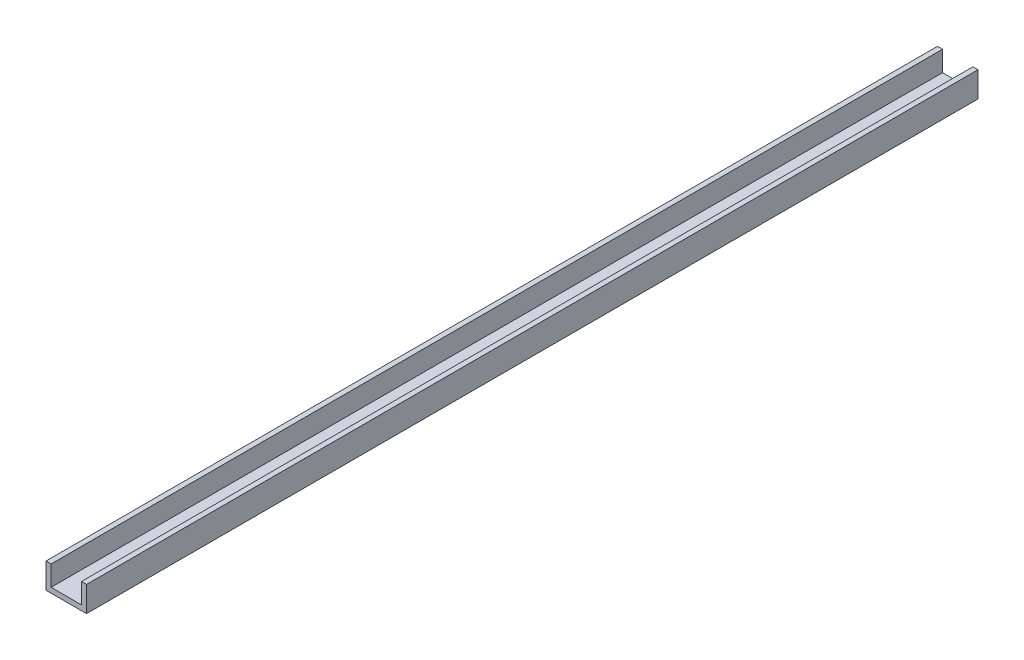
ISO-10303-21;
HEADER;
FILE_DESCRIPTION(('STEP AP214'),'2;1');
FILE_NAME('part.step','',(''),(''),'','','');
FILE_SCHEMA(('AUTOMOTIVE_DESIGN { 1 0 10303 214 1 1 1 1 }'));
ENDSEC;
DATA;
#1=APPLICATION_CONTEXT('core data for automotive mechanical design processes');
#2=APPLICATION_PROTOCOL_DEFINITION('international standard','automotive_design',2000,#1);
#3=PRODUCT_CONTEXT('',#1,'mechanical');
#4=PRODUCT('Part','Part','',(#3));
#5=PRODUCT_RELATED_PRODUCT_CATEGORY('part','',(#4));
#6=PRODUCT_DEFINITION_FORMATION('','',#4);
#7=PRODUCT_DEFINITION_CONTEXT('part definition',#1,'design');
#8=PRODUCT_DEFINITION('design','',#6,#7);
#9=PRODUCT_DEFINITION_SHAPE('','',#8);
#10=(LENGTH_UNIT() NAMED_UNIT(*) SI_UNIT(.MILLI.,.METRE.));
#11=(NAMED_UNIT(*) PLANE_ANGLE_UNIT() SI_UNIT($,.RADIAN.));
#12=(NAMED_UNIT(*) SI_UNIT($,.STERADIAN.) SOLID_ANGLE_UNIT());
#13=UNCERTAINTY_MEASURE_WITH_UNIT(LENGTH_MEASURE(1.E-05),#10,'distance_accuracy_value','');
#14=(GEOMETRIC_REPRESENTATION_CONTEXT(3) GLOBAL_UNCERTAINTY_ASSIGNED_CONTEXT((#13)) GLOBAL_UNIT_ASSIGNED_CONTEXT((#10,
#11,#12)) REPRESENTATION_CONTEXT('',''));
#15=CARTESIAN_POINT('',(0.,0.,0.));
#16=DIRECTION('',(0.,0.,1.));
#17=DIRECTION('',(1.,0.,0.));
#18=AXIS2_PLACEMENT_3D('',#15,#16,#17);
#19=CARTESIAN_POINT('',(-4.76250000000002,3.96875,609.6));
#20=DIRECTION('',(0.,-1.,0.));
#21=DIRECTION('',(0.,0.,-1.));
#22=AXIS2_PLACEMENT_3D('',#19,#20,#21);
#23=PLANE('',#22);
#24=DIRECTION('',(0.,0.,-1.));
#25=VECTOR('',#24,1.);
#26=CARTESIAN_POINT('',(-4.76250000000002,3.96875,609.6));
#27=LINE('',#26,#25);
#28=CARTESIAN_POINT('',(-4.76250000000002,3.96875,609.6));
#29=VERTEX_POINT('',#28);
#30=CARTESIAN_POINT('',(-4.76250000000002,3.96875,330.2));
#31=VERTEX_POINT('',#30);
#32=EDGE_CURVE('E138',#29,#31,#27,.T.);
#33=ORIENTED_EDGE('',*,*,#32,.T.);
#34=DIRECTION('',(-1.,0.,0.));
#35=VECTOR('',#34,1.);
#36=CARTESIAN_POINT('',(-4.76250000000002,3.96875,330.2));
#37=LINE('',#36,#35);
#38=CARTESIAN_POINT('',(-6.35000000000002,3.96875,330.2));
#39=VERTEX_POINT('',#38);
#40=EDGE_CURVE('E67',#31,#39,#37,.T.);
#41=ORIENTED_EDGE('',*,*,#40,.T.);
#42=DIRECTION('',(0.,0.,-1.));
#43=VECTOR('',#42,1.);
#44=CARTESIAN_POINT('',(-6.35000000000002,3.96875,609.6));
#45=LINE('',#44,#43);
#46=CARTESIAN_POINT('',(-6.35000000000002,3.96875,609.6));
#47=VERTEX_POINT('',#46);
#48=EDGE_CURVE('E123',#47,#39,#45,.T.);
#49=ORIENTED_EDGE('',*,*,#48,.F.);
#50=DIRECTION('',(-1.,0.,0.));
#51=VECTOR('',#50,1.);
#52=CARTESIAN_POINT('',(-4.76250000000002,3.96875,609.6));
#53=LINE('',#52,#51);
#54=EDGE_CURVE('E284',#29,#47,#53,.T.);
#55=ORIENTED_EDGE('',*,*,#54,.F.);
#56=EDGE_LOOP('',(#33,#41,#49,#55));
#57=FACE_BOUND('',#56,.T.);
#58=ADVANCED_FACE('F51',(#57),#23,.F.);
#59=CARTESIAN_POINT('',(-6.35000000000002,3.96875,609.6));
#60=DIRECTION('',(1.,0.,0.));
#61=DIRECTION('',(0.,0.,-1.));
#62=AXIS2_PLACEMENT_3D('',#59,#60,#61);
#63=PLANE('',#62);
#64=ORIENTED_EDGE('',*,*,#48,.T.);
#65=DIRECTION('',(0.,-1.,0.));
#66=VECTOR('',#65,1.);
#67=CARTESIAN_POINT('',(-6.35000000000002,3.96875,330.2));
#68=LINE('',#67,#66);
#69=CARTESIAN_POINT('',(-6.35000000000002,-3.96875,330.2));
#70=VERTEX_POINT('',#69);
#71=EDGE_CURVE('E290',#39,#70,#68,.T.);
#72=ORIENTED_EDGE('',*,*,#71,.T.);
#73=DIRECTION('',(0.,0.,-1.));
#74=VECTOR('',#73,1.);
#75=CARTESIAN_POINT('',(-6.35000000000002,-3.96875,609.6));
#76=LINE('',#75,#74);
#77=CARTESIAN_POINT('',(-6.35000000000002,-3.96875,609.6));
#78=VERTEX_POINT('',#77);
#79=EDGE_CURVE('E155',#78,#70,#76,.T.);
#80=ORIENTED_EDGE('',*,*,#79,.F.);
#81=DIRECTION('',(0.,-1.,0.));
#82=VECTOR('',#81,1.);
#83=CARTESIAN_POINT('',(-6.35000000000002,3.96875,609.6));
#84=LINE('',#83,#82);
#85=EDGE_CURVE('E286',#47,#78,#84,.T.);
#86=ORIENTED_EDGE('',*,*,#85,.F.);
#87=EDGE_LOOP('',(#64,#72,#80,#86));
#88=FACE_BOUND('',#87,.T.);
#89=ADVANCED_FACE('F176',(#88),#63,.F.);
#90=CARTESIAN_POINT('',(-6.35000000000002,-3.96875,609.6));
#91=DIRECTION('',(0.,1.,0.));
#92=DIRECTION('',(0.,0.,1.));
#93=AXIS2_PLACEMENT_3D('',#90,#91,#92);
#94=PLANE('',#93);
#95=CARTESIAN_POINT('',(0.,-3.96875,584.2));
#96=DIRECTION('',(0.,1.,0.));
#97=DIRECTION('',(0.,0.,1.));
#98=AXIS2_PLACEMENT_3D('',#95,#96,#97);
#99=CIRCLE('',#98,2.85749999999996);
#100=CARTESIAN_POINT('',(0.,-3.96875,587.0575));
#101=VERTEX_POINT('',#100);
#102=EDGE_CURVE('E12',#101,#101,#99,.T.);
#103=ORIENTED_EDGE('',*,*,#102,.T.);
#104=EDGE_LOOP('',(#103));
#105=FACE_BOUND('',#104,.T.);
#106=ORIENTED_EDGE('',*,*,#79,.T.);
#107=DIRECTION('',(1.,0.,0.));
#108=VECTOR('',#107,1.);
#109=CARTESIAN_POINT('',(-6.35000000000002,-3.96875,330.2));
#110=LINE('',#109,#108);
#111=CARTESIAN_POINT('',(6.34999999999997,-3.96875,330.2));
#112=VERTEX_POINT('',#111);
#113=EDGE_CURVE('E315',#70,#112,#110,.T.);
#114=ORIENTED_EDGE('',*,*,#113,.T.);
#115=DIRECTION('',(0.,0.,-1.));
#116=VECTOR('',#115,1.);
#117=CARTESIAN_POINT('',(6.34999999999997,-3.96875,609.6));
#118=LINE('',#117,#116);
#119=CARTESIAN_POINT('',(6.34999999999997,-3.96875,609.6));
#120=VERTEX_POINT('',#119);
#121=EDGE_CURVE('E152',#120,#112,#118,.T.);
#122=ORIENTED_EDGE('',*,*,#121,.F.);
#123=DIRECTION('',(1.,0.,0.));
#124=VECTOR('',#123,1.);
#125=CARTESIAN_POINT('',(-6.35000000000002,-3.96875,609.6));
#126=LINE('',#125,#124);
#127=EDGE_CURVE('E292',#78,#120,#126,.T.);
#128=ORIENTED_EDGE('',*,*,#127,.F.);
#129=EDGE_LOOP('',(#106,#114,#122,#128));
#130=FACE_BOUND('',#129,.T.);
#131=ADVANCED_FACE('F181',(#105,#130),#94,.F.);
#132=CARTESIAN_POINT('',(6.34999999999997,-3.96875,609.6));
#133=DIRECTION('',(-1.,0.,0.));
#134=DIRECTION('',(0.,-1.,0.));
#135=AXIS2_PLACEMENT_3D('',#132,#133,#134);
#136=PLANE('',#135);
#137=ORIENTED_EDGE('',*,*,#121,.T.);
#138=DIRECTION('',(0.,1.,0.));
#139=VECTOR('',#138,1.);
#140=CARTESIAN_POINT('',(6.34999999999997,-3.96875,330.2));
#141=LINE('',#140,#139);
#142=CARTESIAN_POINT('',(6.34999999999996,3.96875,330.2));
#143=VERTEX_POINT('',#142);
#144=EDGE_CURVE('E310',#112,#143,#141,.T.);
#145=ORIENTED_EDGE('',*,*,#144,.T.);
#146=DIRECTION('',(0.,0.,-1.));
#147=VECTOR('',#146,1.);
#148=CARTESIAN_POINT('',(6.34999999999996,3.96875,609.6));
#149=LINE('',#148,#147);
#150=CARTESIAN_POINT('',(6.34999999999996,3.96875,609.6));
#151=VERTEX_POINT('',#150);
#152=EDGE_CURVE('E149',#151,#143,#149,.T.);
#153=ORIENTED_EDGE('',*,*,#152,.F.);
#154=DIRECTION('',(0.,1.,0.));
#155=VECTOR('',#154,1.);
#156=CARTESIAN_POINT('',(6.34999999999997,-3.96875,609.6));
#157=LINE('',#156,#155);
#158=EDGE_CURVE('E294',#120,#151,#157,.T.);
#159=ORIENTED_EDGE('',*,*,#158,.F.);
#160=EDGE_LOOP('',(#137,#145,#153,#159));
#161=FACE_BOUND('',#160,.T.);
#162=ADVANCED_FACE('F187',(#161),#136,.F.);
#163=CARTESIAN_POINT('',(6.34999999999996,3.96875,609.6));
#164=DIRECTION('',(0.,-1.,0.));
#165=DIRECTION('',(0.,0.,-1.));
#166=AXIS2_PLACEMENT_3D('',#163,#164,#165);
#167=PLANE('',#166);
#168=ORIENTED_EDGE('',*,*,#152,.T.);
#169=DIRECTION('',(-1.,0.,0.));
#170=VECTOR('',#169,1.);
#171=CARTESIAN_POINT('',(6.34999999999996,3.96875,330.2));
#172=LINE('',#171,#170);
#173=CARTESIAN_POINT('',(4.76249999999996,3.96875,330.2));
#174=VERTEX_POINT('',#173);
#175=EDGE_CURVE('E308',#143,#174,#172,.T.);
#176=ORIENTED_EDGE('',*,*,#175,.T.);
#177=DIRECTION('',(0.,0.,-1.));
#178=VECTOR('',#177,1.);
#179=CARTESIAN_POINT('',(4.76249999999996,3.96875,609.6));
#180=LINE('',#179,#178);
#181=CARTESIAN_POINT('',(4.76249999999996,3.96875,609.6));
#182=VERTEX_POINT('',#181);
#183=EDGE_CURVE('E142',#182,#174,#180,.T.);
#184=ORIENTED_EDGE('',*,*,#183,.F.);
#185=DIRECTION('',(-1.,0.,0.));
#186=VECTOR('',#185,1.);
#187=CARTESIAN_POINT('',(6.34999999999996,3.96875,609.6));
#188=LINE('',#187,#186);
#189=EDGE_CURVE('E299',#151,#182,#188,.T.);
#190=ORIENTED_EDGE('',*,*,#189,.F.);
#191=EDGE_LOOP('',(#168,#176,#184,#190));
#192=FACE_BOUND('',#191,.T.);
#193=ADVANCED_FACE('F191',(#192),#167,.F.);
#194=CARTESIAN_POINT('',(4.76249999999996,3.96875,609.6));
#195=DIRECTION('',(1.,0.,0.));
#196=DIRECTION('',(0.,0.,-1.));
#197=AXIS2_PLACEMENT_3D('',#194,#195,#196);
#198=PLANE('',#197);
#199=ORIENTED_EDGE('',*,*,#183,.T.);
#200=DIRECTION('',(0.,-1.,0.));
#201=VECTOR('',#200,1.);
#202=CARTESIAN_POINT('',(4.76249999999996,3.96875,330.2));
#203=LINE('',#202,#201);
#204=CARTESIAN_POINT('',(4.76249999999996,-2.38125,330.2));
#205=VERTEX_POINT('',#204);
#206=EDGE_CURVE('E133',#174,#205,#203,.T.);
#207=ORIENTED_EDGE('',*,*,#206,.T.);
#208=DIRECTION('',(0.,0.,-1.));
#209=VECTOR('',#208,1.);
#210=CARTESIAN_POINT('',(4.76249999999996,-2.38125,609.6));
#211=LINE('',#210,#209);
#212=CARTESIAN_POINT('',(4.76249999999996,-2.38125,609.6));
#213=VERTEX_POINT('',#212);
#214=EDGE_CURVE('E132',#213,#205,#211,.T.);
#215=ORIENTED_EDGE('',*,*,#214,.F.);
#216=DIRECTION('',(0.,-1.,0.));
#217=VECTOR('',#216,1.);
#218=CARTESIAN_POINT('',(4.76249999999996,3.96875,609.6));
#219=LINE('',#218,#217);
#220=EDGE_CURVE('E301',#182,#213,#219,.T.);
#221=ORIENTED_EDGE('',*,*,#220,.F.);
#222=EDGE_LOOP('',(#199,#207,#215,#221));
#223=FACE_BOUND('',#222,.T.);
#224=ADVANCED_FACE('F195',(#223),#198,.F.);
#225=CARTESIAN_POINT('',(4.76249999999996,-2.38125,609.6));
#226=DIRECTION('',(0.,-1.,0.));
#227=DIRECTION('',(1.,0.,0.));
#228=AXIS2_PLACEMENT_3D('',#225,#226,#227);
#229=PLANE('',#228);
#230=CARTESIAN_POINT('',(0.,-2.38125,584.2));
#231=DIRECTION('',(0.,-1.,0.));
#232=DIRECTION('',(1.,0.,0.));
#233=AXIS2_PLACEMENT_3D('',#230,#231,#232);
#234=CIRCLE('',#233,1.58750000000002);
#235=CARTESIAN_POINT('',(1.58750000000002,-2.38125,584.2));
#236=VERTEX_POINT('',#235);
#237=EDGE_CURVE('E134',#236,#236,#234,.T.);
#238=ORIENTED_EDGE('',*,*,#237,.T.);
#239=EDGE_LOOP('',(#238));
#240=FACE_BOUND('',#239,.T.);
#241=ORIENTED_EDGE('',*,*,#214,.T.);
#242=DIRECTION('',(-1.,0.,0.));
#243=VECTOR('',#242,1.);
#244=CARTESIAN_POINT('',(4.76249999999996,-2.38125,330.2));
#245=LINE('',#244,#243);
#246=CARTESIAN_POINT('',(-4.76250000000002,-2.38125,330.2));
#247=VERTEX_POINT('',#246);
#248=EDGE_CURVE('E118',#205,#247,#245,.T.);
#249=ORIENTED_EDGE('',*,*,#248,.T.);
#250=DIRECTION('',(0.,0.,-1.));
#251=VECTOR('',#250,1.);
#252=CARTESIAN_POINT('',(-4.76250000000002,-2.38125,609.6));
#253=LINE('',#252,#251);
#254=CARTESIAN_POINT('',(-4.76250000000002,-2.38125,609.6));
#255=VERTEX_POINT('',#254);
#256=EDGE_CURVE('E130',#255,#247,#253,.T.);
#257=ORIENTED_EDGE('',*,*,#256,.F.);
#258=DIRECTION('',(-1.,0.,0.));
#259=VECTOR('',#258,1.);
#260=CARTESIAN_POINT('',(4.76249999999996,-2.38125,609.6));
#261=LINE('',#260,#259);
#262=EDGE_CURVE('E303',#213,#255,#261,.T.);
#263=ORIENTED_EDGE('',*,*,#262,.F.);
#264=EDGE_LOOP('',(#241,#249,#257,#263));
#265=FACE_BOUND('',#264,.T.);
#266=ADVANCED_FACE('F128',(#240,#265),#229,.F.);
#267=CARTESIAN_POINT('',(-4.76250000000002,-2.38125,609.6));
#268=DIRECTION('',(-1.,0.,0.));
#269=DIRECTION('',(0.,0.,1.));
#270=AXIS2_PLACEMENT_3D('',#267,#268,#269);
#271=PLANE('',#270);
#272=ORIENTED_EDGE('',*,*,#256,.T.);
#273=DIRECTION('',(0.,1.,0.));
#274=VECTOR('',#273,1.);
#275=CARTESIAN_POINT('',(-4.76250000000002,-2.38125,330.2));
#276=LINE('',#275,#274);
#277=EDGE_CURVE('E115',#247,#31,#276,.T.);
#278=ORIENTED_EDGE('',*,*,#277,.T.);
#279=ORIENTED_EDGE('',*,*,#32,.F.);
#280=DIRECTION('',(0.,1.,0.));
#281=VECTOR('',#280,1.);
#282=CARTESIAN_POINT('',(-4.76250000000002,-2.38125,609.6));
#283=LINE('',#282,#281);
#284=EDGE_CURVE('E75',#255,#29,#283,.T.);
#285=ORIENTED_EDGE('',*,*,#284,.F.);
#286=EDGE_LOOP('',(#272,#278,#279,#285));
#287=FACE_BOUND('',#286,.T.);
#288=ADVANCED_FACE('F136',(#287),#271,.F.);
#289=CARTESIAN_POINT('',(0.,0.,609.6));
#290=DIRECTION('',(0.,0.,1.));
#291=DIRECTION('',(1.,0.,0.));
#292=AXIS2_PLACEMENT_3D('',#289,#290,#291);
#293=PLANE('',#292);
#294=ORIENTED_EDGE('',*,*,#54,.T.);
#295=ORIENTED_EDGE('',*,*,#85,.T.);
#296=ORIENTED_EDGE('',*,*,#127,.T.);
#297=ORIENTED_EDGE('',*,*,#158,.T.);
#298=ORIENTED_EDGE('',*,*,#189,.T.);
#299=ORIENTED_EDGE('',*,*,#220,.T.);
#300=ORIENTED_EDGE('',*,*,#262,.T.);
#301=ORIENTED_EDGE('',*,*,#284,.T.);
#302=EDGE_LOOP('',(#294,#295,#296,#297,#298,#299,#300,#301));
#303=FACE_BOUND('',#302,.T.);
#304=ADVANCED_FACE('F205',(#303),#293,.T.);
#305=CARTESIAN_POINT('',(0.,0.,330.2));
#306=DIRECTION('',(0.,0.,1.));
#307=DIRECTION('',(1.,0.,0.));
#308=AXIS2_PLACEMENT_3D('',#305,#306,#307);
#309=PLANE('',#308);
#310=ORIENTED_EDGE('',*,*,#277,.F.);
#311=ORIENTED_EDGE('',*,*,#248,.F.);
#312=ORIENTED_EDGE('',*,*,#206,.F.);
#313=ORIENTED_EDGE('',*,*,#175,.F.);
#314=ORIENTED_EDGE('',*,*,#144,.F.);
#315=ORIENTED_EDGE('',*,*,#113,.F.);
#316=ORIENTED_EDGE('',*,*,#71,.F.);
#317=ORIENTED_EDGE('',*,*,#40,.F.);
#318=EDGE_LOOP('',(#310,#311,#312,#313,#314,#315,#316,#317));
#319=FACE_BOUND('',#318,.T.);
#320=ADVANCED_FACE('F117',(#319),#309,.F.);
#321=CARTESIAN_POINT('',(0.,3.96875,584.2));
#322=DIRECTION('',(0.,-1.,0.));
#323=DIRECTION('',(0.,0.,-1.));
#324=AXIS2_PLACEMENT_3D('',#321,#322,#323);
#325=CYLINDRICAL_SURFACE('',#324,1.58750000000002);
#326=CARTESIAN_POINT('',(0.,-2.69875000000013,584.2));
#327=DIRECTION('',(0.,1.,0.));
#328=DIRECTION('',(0.,0.,1.));
#329=AXIS2_PLACEMENT_3D('',#326,#327,#328);
#330=CIRCLE('',#329,1.58750000000002);
#331=CARTESIAN_POINT('',(0.,-2.69875000000013,585.7875));
#332=VERTEX_POINT('',#331);
#333=EDGE_CURVE('E60',#332,#332,#330,.F.);
#334=ORIENTED_EDGE('',*,*,#333,.T.);
#335=EDGE_LOOP('',(#334));
#336=FACE_BOUND('',#335,.T.);
#337=ORIENTED_EDGE('',*,*,#237,.F.);
#338=EDGE_LOOP('',(#337));
#339=FACE_BOUND('',#338,.T.);
#340=ADVANCED_FACE('F165',(#336,#339),#325,.F.);
#341=CARTESIAN_POINT('',(0.,-2.69875000000013,584.2));
#342=DIRECTION('',(0.,-1.,0.));
#343=DIRECTION('',(0.,0.,-1.));
#344=AXIS2_PLACEMENT_3D('',#341,#342,#343);
#345=CONICAL_SURFACE('',#344,1.58750000000002,0.785398163397479);
#346=ORIENTED_EDGE('',*,*,#102,.F.);
#347=EDGE_LOOP('',(#346));
#348=FACE_BOUND('',#347,.T.);
#349=ORIENTED_EDGE('',*,*,#333,.F.);
#350=EDGE_LOOP('',(#349));
#351=FACE_BOUND('',#350,.T.);
#352=ADVANCED_FACE('F54',(#348,#351),#345,.F.);
#353=CLOSED_SHELL('',(#58,#89,#131,#162,#193,#224,#266,#288,#304,#320,#340,#352));
#354=MANIFOLD_SOLID_BREP('B2',#353);
#355=ADVANCED_BREP_SHAPE_REPRESENTATION('',(#18,#354),#14);
#356=SHAPE_DEFINITION_REPRESENTATION(#9,#355);
ENDSEC;
END-ISO-10303-21;
